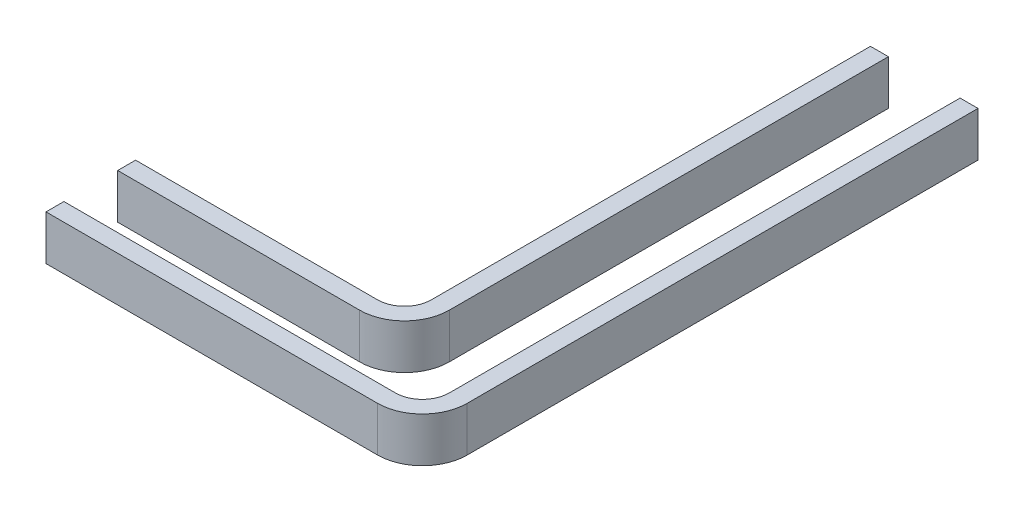
ISO-10303-21;
HEADER;
FILE_DESCRIPTION(('STEP AP214'),'2;1');
FILE_NAME('part.step','',(''),(''),'','','');
FILE_SCHEMA(('AUTOMOTIVE_DESIGN { 1 0 10303 214 1 1 1 1 }'));
ENDSEC;
DATA;
#1=APPLICATION_CONTEXT('core data for automotive mechanical design processes');
#2=APPLICATION_PROTOCOL_DEFINITION('international standard','automotive_design',2000,#1);
#3=PRODUCT_CONTEXT('',#1,'mechanical');
#4=PRODUCT('Part','Part','',(#3));
#5=PRODUCT_RELATED_PRODUCT_CATEGORY('part','',(#4));
#6=PRODUCT_DEFINITION_FORMATION('','',#4);
#7=PRODUCT_DEFINITION_CONTEXT('part definition',#1,'design');
#8=PRODUCT_DEFINITION('design','',#6,#7);
#9=PRODUCT_DEFINITION_SHAPE('','',#8);
#10=(LENGTH_UNIT() NAMED_UNIT(*) SI_UNIT(.MILLI.,.METRE.));
#11=(NAMED_UNIT(*) PLANE_ANGLE_UNIT() SI_UNIT($,.RADIAN.));
#12=(NAMED_UNIT(*) SI_UNIT($,.STERADIAN.) SOLID_ANGLE_UNIT());
#13=UNCERTAINTY_MEASURE_WITH_UNIT(LENGTH_MEASURE(1.E-05),#10,'distance_accuracy_value','');
#14=(GEOMETRIC_REPRESENTATION_CONTEXT(3) GLOBAL_UNCERTAINTY_ASSIGNED_CONTEXT((#13)) GLOBAL_UNIT_ASSIGNED_CONTEXT((#10,
#11,#12)) REPRESENTATION_CONTEXT('',''));
#15=CARTESIAN_POINT('',(0.,0.,0.));
#16=DIRECTION('',(0.,0.,1.));
#17=DIRECTION('',(1.,0.,0.));
#18=AXIS2_PLACEMENT_3D('',#15,#16,#17);
#19=CARTESIAN_POINT('',(0.,5.,0.));
#20=DIRECTION('',(0.,1.,0.));
#21=DIRECTION('',(0.,0.,1.));
#22=AXIS2_PLACEMENT_3D('',#19,#20,#21);
#23=PLANE('',#22);
#24=DIRECTION('',(1.,0.,0.));
#25=VECTOR('',#24,1.);
#26=CARTESIAN_POINT('',(0.,5.,-57.));
#27=LINE('',#26,#25);
#28=CARTESIAN_POINT('',(30.,5.,-57.));
#29=VERTEX_POINT('',#28);
#30=CARTESIAN_POINT('',(32.,5.,-57.));
#31=VERTEX_POINT('',#30);
#32=EDGE_CURVE('E169',#29,#31,#27,.T.);
#33=ORIENTED_EDGE('',*,*,#32,.F.);
#34=DIRECTION('',(0.,0.,1.));
#35=VECTOR('',#34,1.);
#36=CARTESIAN_POINT('',(30.,5.,0.));
#37=LINE('',#36,#35);
#38=CARTESIAN_POINT('',(30.,5.,-8.));
#39=VERTEX_POINT('',#38);
#40=EDGE_CURVE('E221',#29,#39,#37,.T.);
#41=ORIENTED_EDGE('',*,*,#40,.T.);
#42=CARTESIAN_POINT('',(27.,5.,-8.));
#43=DIRECTION('',(0.,1.,0.));
#44=DIRECTION('',(0.,0.,1.));
#45=AXIS2_PLACEMENT_3D('',#42,#43,#44);
#46=CIRCLE('',#45,3.);
#47=CARTESIAN_POINT('',(27.,5.,-5.));
#48=VERTEX_POINT('',#47);
#49=EDGE_CURVE('E223',#39,#48,#46,.F.);
#50=ORIENTED_EDGE('',*,*,#49,.T.);
#51=DIRECTION('',(1.,0.,0.));
#52=VECTOR('',#51,1.);
#53=CARTESIAN_POINT('',(0.,5.,-5.));
#54=LINE('',#53,#52);
#55=CARTESIAN_POINT('',(0.,5.,-5.));
#56=VERTEX_POINT('',#55);
#57=EDGE_CURVE('E225',#56,#48,#54,.T.);
#58=ORIENTED_EDGE('',*,*,#57,.F.);
#59=DIRECTION('',(0.,0.,-1.));
#60=VECTOR('',#59,1.);
#61=CARTESIAN_POINT('',(0.,5.,0.));
#62=LINE('',#61,#60);
#63=CARTESIAN_POINT('',(0.,5.,-3.));
#64=VERTEX_POINT('',#63);
#65=EDGE_CURVE('E235',#64,#56,#62,.T.);
#66=ORIENTED_EDGE('',*,*,#65,.F.);
#67=DIRECTION('',(1.,0.,0.));
#68=VECTOR('',#67,1.);
#69=CARTESIAN_POINT('',(0.,5.,-3.));
#70=LINE('',#69,#68);
#71=CARTESIAN_POINT('',(27.,5.,-3.));
#72=VERTEX_POINT('',#71);
#73=EDGE_CURVE('E227',#64,#72,#70,.T.);
#74=ORIENTED_EDGE('',*,*,#73,.T.);
#75=CARTESIAN_POINT('',(27.,5.,-8.));
#76=DIRECTION('',(0.,1.,0.));
#77=DIRECTION('',(0.,0.,1.));
#78=AXIS2_PLACEMENT_3D('',#75,#76,#77);
#79=CIRCLE('',#78,5.);
#80=CARTESIAN_POINT('',(32.,5.,-8.));
#81=VERTEX_POINT('',#80);
#82=EDGE_CURVE('E241',#72,#81,#79,.T.);
#83=ORIENTED_EDGE('',*,*,#82,.T.);
#84=DIRECTION('',(0.,0.,1.));
#85=VECTOR('',#84,1.);
#86=CARTESIAN_POINT('',(32.,5.,0.));
#87=LINE('',#86,#85);
#88=EDGE_CURVE('E254',#31,#81,#87,.T.);
#89=ORIENTED_EDGE('',*,*,#88,.F.);
#90=EDGE_LOOP('',(#33,#41,#50,#58,#66,#74,#83,#89));
#91=FACE_BOUND('',#90,.T.);
#92=ADVANCED_FACE('F143',(#91),#23,.T.);
#93=CARTESIAN_POINT('',(0.,0.,0.));
#94=DIRECTION('',(0.,1.,0.));
#95=DIRECTION('',(0.,0.,1.));
#96=AXIS2_PLACEMENT_3D('',#93,#94,#95);
#97=PLANE('',#96);
#98=DIRECTION('',(0.,0.,1.));
#99=VECTOR('',#98,1.);
#100=CARTESIAN_POINT('',(30.,0.,0.));
#101=LINE('',#100,#99);
#102=CARTESIAN_POINT('',(30.,0.,-57.));
#103=VERTEX_POINT('',#102);
#104=CARTESIAN_POINT('',(30.,0.,-8.));
#105=VERTEX_POINT('',#104);
#106=EDGE_CURVE('E214',#103,#105,#101,.T.);
#107=ORIENTED_EDGE('',*,*,#106,.F.);
#108=DIRECTION('',(1.,0.,0.));
#109=VECTOR('',#108,1.);
#110=CARTESIAN_POINT('',(30.,0.,-57.));
#111=LINE('',#110,#109);
#112=CARTESIAN_POINT('',(32.,0.,-57.));
#113=VERTEX_POINT('',#112);
#114=EDGE_CURVE('E147',#103,#113,#111,.T.);
#115=ORIENTED_EDGE('',*,*,#114,.T.);
#116=DIRECTION('',(0.,0.,1.));
#117=VECTOR('',#116,1.);
#118=CARTESIAN_POINT('',(32.,0.,0.));
#119=LINE('',#118,#117);
#120=CARTESIAN_POINT('',(32.,0.,-8.));
#121=VERTEX_POINT('',#120);
#122=EDGE_CURVE('E250',#113,#121,#119,.T.);
#123=ORIENTED_EDGE('',*,*,#122,.T.);
#124=CARTESIAN_POINT('',(27.,0.,-8.));
#125=DIRECTION('',(0.,1.,0.));
#126=DIRECTION('',(0.,0.,1.));
#127=AXIS2_PLACEMENT_3D('',#124,#125,#126);
#128=CIRCLE('',#127,5.);
#129=CARTESIAN_POINT('',(27.,0.,-3.));
#130=VERTEX_POINT('',#129);
#131=EDGE_CURVE('E247',#121,#130,#128,.F.);
#132=ORIENTED_EDGE('',*,*,#131,.T.);
#133=DIRECTION('',(1.,0.,0.));
#134=VECTOR('',#133,1.);
#135=CARTESIAN_POINT('',(0.,0.,-3.));
#136=LINE('',#135,#134);
#137=CARTESIAN_POINT('',(0.,0.,-3.));
#138=VERTEX_POINT('',#137);
#139=EDGE_CURVE('E246',#138,#130,#136,.T.);
#140=ORIENTED_EDGE('',*,*,#139,.F.);
#141=DIRECTION('',(0.,0.,-1.));
#142=VECTOR('',#141,1.);
#143=CARTESIAN_POINT('',(0.,0.,0.));
#144=LINE('',#143,#142);
#145=CARTESIAN_POINT('',(0.,0.,-5.));
#146=VERTEX_POINT('',#145);
#147=EDGE_CURVE('E249',#138,#146,#144,.T.);
#148=ORIENTED_EDGE('',*,*,#147,.T.);
#149=DIRECTION('',(1.,0.,0.));
#150=VECTOR('',#149,1.);
#151=CARTESIAN_POINT('',(0.,0.,-5.));
#152=LINE('',#151,#150);
#153=CARTESIAN_POINT('',(27.,0.,-5.));
#154=VERTEX_POINT('',#153);
#155=EDGE_CURVE('E260',#146,#154,#152,.T.);
#156=ORIENTED_EDGE('',*,*,#155,.T.);
#157=CARTESIAN_POINT('',(27.,0.,-8.));
#158=DIRECTION('',(0.,1.,0.));
#159=DIRECTION('',(0.,0.,1.));
#160=AXIS2_PLACEMENT_3D('',#157,#158,#159);
#161=CIRCLE('',#160,3.);
#162=EDGE_CURVE('E177',#154,#105,#161,.T.);
#163=ORIENTED_EDGE('',*,*,#162,.T.);
#164=EDGE_LOOP('',(#107,#115,#123,#132,#140,#148,#156,#163));
#165=FACE_BOUND('',#164,.T.);
#166=ADVANCED_FACE('F283',(#165),#97,.F.);
#167=CARTESIAN_POINT('',(30.,5.,0.));
#168=DIRECTION('',(1.,0.,0.));
#169=DIRECTION('',(0.,0.,-1.));
#170=AXIS2_PLACEMENT_3D('',#167,#168,#169);
#171=PLANE('',#170);
#172=ORIENTED_EDGE('',*,*,#40,.F.);
#173=DIRECTION('',(0.,1.,0.));
#174=VECTOR('',#173,1.);
#175=CARTESIAN_POINT('',(30.,0.,-57.));
#176=LINE('',#175,#174);
#177=EDGE_CURVE('E13',#103,#29,#176,.T.);
#178=ORIENTED_EDGE('',*,*,#177,.F.);
#179=ORIENTED_EDGE('',*,*,#106,.T.);
#180=DIRECTION('',(0.,-1.,0.));
#181=VECTOR('',#180,1.);
#182=CARTESIAN_POINT('',(30.,5.,-8.));
#183=LINE('',#182,#181);
#184=EDGE_CURVE('E232',#105,#39,#183,.F.);
#185=ORIENTED_EDGE('',*,*,#184,.T.);
#186=EDGE_LOOP('',(#172,#178,#179,#185));
#187=FACE_BOUND('',#186,.T.);
#188=ADVANCED_FACE('F285',(#187),#171,.F.);
#189=CARTESIAN_POINT('',(0.,5.,-5.));
#190=DIRECTION('',(0.,0.,-1.));
#191=DIRECTION('',(-1.,0.,0.));
#192=AXIS2_PLACEMENT_3D('',#189,#190,#191);
#193=PLANE('',#192);
#194=ORIENTED_EDGE('',*,*,#57,.T.);
#195=DIRECTION('',(0.,-1.,0.));
#196=VECTOR('',#195,1.);
#197=CARTESIAN_POINT('',(27.,5.,-5.));
#198=LINE('',#197,#196);
#199=EDGE_CURVE('E230',#48,#154,#198,.T.);
#200=ORIENTED_EDGE('',*,*,#199,.T.);
#201=ORIENTED_EDGE('',*,*,#155,.F.);
#202=DIRECTION('',(0.,-1.,0.));
#203=VECTOR('',#202,1.);
#204=CARTESIAN_POINT('',(0.,5.,-5.));
#205=LINE('',#204,#203);
#206=EDGE_CURVE('E208',#56,#146,#205,.T.);
#207=ORIENTED_EDGE('',*,*,#206,.F.);
#208=EDGE_LOOP('',(#194,#200,#201,#207));
#209=FACE_BOUND('',#208,.T.);
#210=ADVANCED_FACE('F229',(#209),#193,.T.);
#211=CARTESIAN_POINT('',(0.,5.,0.));
#212=DIRECTION('',(-1.,0.,0.));
#213=DIRECTION('',(0.,0.,1.));
#214=AXIS2_PLACEMENT_3D('',#211,#212,#213);
#215=PLANE('',#214);
#216=ORIENTED_EDGE('',*,*,#147,.F.);
#217=DIRECTION('',(0.,-1.,0.));
#218=VECTOR('',#217,1.);
#219=CARTESIAN_POINT('',(0.,5.,-3.));
#220=LINE('',#219,#218);
#221=EDGE_CURVE('E245',#64,#138,#220,.T.);
#222=ORIENTED_EDGE('',*,*,#221,.F.);
#223=ORIENTED_EDGE('',*,*,#65,.T.);
#224=ORIENTED_EDGE('',*,*,#206,.T.);
#225=EDGE_LOOP('',(#216,#222,#223,#224));
#226=FACE_BOUND('',#225,.T.);
#227=ADVANCED_FACE('F292',(#226),#215,.T.);
#228=CARTESIAN_POINT('',(0.,5.,-3.));
#229=DIRECTION('',(0.,0.,-1.));
#230=DIRECTION('',(-1.,0.,0.));
#231=AXIS2_PLACEMENT_3D('',#228,#229,#230);
#232=PLANE('',#231);
#233=ORIENTED_EDGE('',*,*,#139,.T.);
#234=DIRECTION('',(0.,-1.,0.));
#235=VECTOR('',#234,1.);
#236=CARTESIAN_POINT('',(27.,5.,-3.));
#237=LINE('',#236,#235);
#238=EDGE_CURVE('E243',#130,#72,#237,.F.);
#239=ORIENTED_EDGE('',*,*,#238,.T.);
#240=ORIENTED_EDGE('',*,*,#73,.F.);
#241=ORIENTED_EDGE('',*,*,#221,.T.);
#242=EDGE_LOOP('',(#233,#239,#240,#241));
#243=FACE_BOUND('',#242,.T.);
#244=ADVANCED_FACE('F294',(#243),#232,.F.);
#245=CARTESIAN_POINT('',(32.,5.,0.));
#246=DIRECTION('',(1.,0.,0.));
#247=DIRECTION('',(0.,0.,-1.));
#248=AXIS2_PLACEMENT_3D('',#245,#246,#247);
#249=PLANE('',#248);
#250=ORIENTED_EDGE('',*,*,#88,.T.);
#251=DIRECTION('',(0.,-1.,0.));
#252=VECTOR('',#251,1.);
#253=CARTESIAN_POINT('',(32.,0.,-8.));
#254=LINE('',#253,#252);
#255=EDGE_CURVE('E251',#81,#121,#254,.T.);
#256=ORIENTED_EDGE('',*,*,#255,.T.);
#257=ORIENTED_EDGE('',*,*,#122,.F.);
#258=DIRECTION('',(0.,-1.,0.));
#259=VECTOR('',#258,1.);
#260=CARTESIAN_POINT('',(32.,5.,-57.));
#261=LINE('',#260,#259);
#262=EDGE_CURVE('E153',#31,#113,#261,.T.);
#263=ORIENTED_EDGE('',*,*,#262,.F.);
#264=EDGE_LOOP('',(#250,#256,#257,#263));
#265=FACE_BOUND('',#264,.T.);
#266=ADVANCED_FACE('F281',(#265),#249,.T.);
#267=CARTESIAN_POINT('',(27.,5.,-8.));
#268=DIRECTION('',(0.,1.,0.));
#269=DIRECTION('',(0.,0.,1.));
#270=AXIS2_PLACEMENT_3D('',#267,#268,#269);
#271=CYLINDRICAL_SURFACE('',#270,5.);
#272=ORIENTED_EDGE('',*,*,#82,.F.);
#273=ORIENTED_EDGE('',*,*,#238,.F.);
#274=ORIENTED_EDGE('',*,*,#131,.F.);
#275=ORIENTED_EDGE('',*,*,#255,.F.);
#276=EDGE_LOOP('',(#272,#273,#274,#275));
#277=FACE_BOUND('',#276,.T.);
#278=ADVANCED_FACE('F278',(#277),#271,.T.);
#279=CARTESIAN_POINT('',(27.,5.,-8.));
#280=DIRECTION('',(0.,-1.,0.));
#281=DIRECTION('',(0.,0.,-1.));
#282=AXIS2_PLACEMENT_3D('',#279,#280,#281);
#283=CYLINDRICAL_SURFACE('',#282,3.);
#284=ORIENTED_EDGE('',*,*,#49,.F.);
#285=ORIENTED_EDGE('',*,*,#184,.F.);
#286=ORIENTED_EDGE('',*,*,#162,.F.);
#287=ORIENTED_EDGE('',*,*,#199,.F.);
#288=EDGE_LOOP('',(#284,#285,#286,#287));
#289=FACE_BOUND('',#288,.T.);
#290=ADVANCED_FACE('F234',(#289),#283,.F.);
#291=CARTESIAN_POINT('',(30.,0.,-57.));
#292=DIRECTION('',(0.,0.,1.));
#293=DIRECTION('',(1.,0.,0.));
#294=AXIS2_PLACEMENT_3D('',#291,#292,#293);
#295=PLANE('',#294);
#296=ORIENTED_EDGE('',*,*,#32,.T.);
#297=ORIENTED_EDGE('',*,*,#262,.T.);
#298=ORIENTED_EDGE('',*,*,#114,.F.);
#299=ORIENTED_EDGE('',*,*,#177,.T.);
#300=EDGE_LOOP('',(#296,#297,#298,#299));
#301=FACE_BOUND('',#300,.T.);
#302=ADVANCED_FACE('F145',(#301),#295,.F.);
#303=CLOSED_SHELL('',(#92,#166,#188,#210,#227,#244,#266,#278,#290,#302));
#304=MANIFOLD_SOLID_BREP('B2',#303);
#305=CARTESIAN_POINT('',(37.,5.,0.));
#306=DIRECTION('',(0.,-1.,0.));
#307=DIRECTION('',(0.,0.,-1.));
#308=AXIS2_PLACEMENT_3D('',#305,#306,#307);
#309=CYLINDRICAL_SURFACE('',#308,3.);
#310=CARTESIAN_POINT('',(37.,5.,0.));
#311=DIRECTION('',(0.,1.,0.));
#312=DIRECTION('',(0.,0.,1.));
#313=AXIS2_PLACEMENT_3D('',#310,#311,#312);
#314=CIRCLE('',#313,3.);
#315=CARTESIAN_POINT('',(40.,5.,0.));
#316=VERTEX_POINT('',#315);
#317=CARTESIAN_POINT('',(37.,5.,3.));
#318=VERTEX_POINT('',#317);
#319=EDGE_CURVE('E141',#316,#318,#314,.F.);
#320=ORIENTED_EDGE('',*,*,#319,.F.);
#321=DIRECTION('',(0.,-1.,0.));
#322=VECTOR('',#321,1.);
#323=CARTESIAN_POINT('',(40.,5.,0.));
#324=LINE('',#323,#322);
#325=CARTESIAN_POINT('',(40.,0.,0.));
#326=VERTEX_POINT('',#325);
#327=EDGE_CURVE('E408',#326,#316,#324,.F.);
#328=ORIENTED_EDGE('',*,*,#327,.F.);
#329=CARTESIAN_POINT('',(37.,0.,0.));
#330=DIRECTION('',(0.,1.,0.));
#331=DIRECTION('',(0.,0.,1.));
#332=AXIS2_PLACEMENT_3D('',#329,#330,#331);
#333=CIRCLE('',#332,3.);
#334=CARTESIAN_POINT('',(37.,0.,3.));
#335=VERTEX_POINT('',#334);
#336=EDGE_CURVE('E393',#335,#326,#333,.T.);
#337=ORIENTED_EDGE('',*,*,#336,.F.);
#338=DIRECTION('',(0.,-1.,0.));
#339=VECTOR('',#338,1.);
#340=CARTESIAN_POINT('',(37.,5.,3.));
#341=LINE('',#340,#339);
#342=EDGE_CURVE('E490',#318,#335,#341,.T.);
#343=ORIENTED_EDGE('',*,*,#342,.F.);
#344=EDGE_LOOP('',(#320,#328,#337,#343));
#345=FACE_BOUND('',#344,.T.);
#346=ADVANCED_FACE('F386',(#345),#309,.F.);
#347=CARTESIAN_POINT('',(0.,5.,3.));
#348=DIRECTION('',(0.,0.,-1.));
#349=DIRECTION('',(-1.,0.,0.));
#350=AXIS2_PLACEMENT_3D('',#347,#348,#349);
#351=PLANE('',#350);
#352=DIRECTION('',(1.,0.,0.));
#353=VECTOR('',#352,1.);
#354=CARTESIAN_POINT('',(0.,5.,3.));
#355=LINE('',#354,#353);
#356=CARTESIAN_POINT('',(0.,5.,3.));
#357=VERTEX_POINT('',#356);
#358=EDGE_CURVE('E499',#357,#318,#355,.T.);
#359=ORIENTED_EDGE('',*,*,#358,.T.);
#360=ORIENTED_EDGE('',*,*,#342,.T.);
#361=DIRECTION('',(1.,0.,0.));
#362=VECTOR('',#361,1.);
#363=CARTESIAN_POINT('',(0.,0.,3.));
#364=LINE('',#363,#362);
#365=CARTESIAN_POINT('',(0.,0.,3.));
#366=VERTEX_POINT('',#365);
#367=EDGE_CURVE('E466',#366,#335,#364,.T.);
#368=ORIENTED_EDGE('',*,*,#367,.F.);
#369=DIRECTION('',(0.,-1.,0.));
#370=VECTOR('',#369,1.);
#371=CARTESIAN_POINT('',(0.,5.,3.));
#372=LINE('',#371,#370);
#373=EDGE_CURVE('E462',#357,#366,#372,.T.);
#374=ORIENTED_EDGE('',*,*,#373,.F.);
#375=EDGE_LOOP('',(#359,#360,#368,#374));
#376=FACE_BOUND('',#375,.T.);
#377=ADVANCED_FACE('F497',(#376),#351,.T.);
#378=CARTESIAN_POINT('',(0.,5.,0.));
#379=DIRECTION('',(-1.,0.,0.));
#380=DIRECTION('',(0.,0.,1.));
#381=AXIS2_PLACEMENT_3D('',#378,#379,#380);
#382=PLANE('',#381);
#383=DIRECTION('',(0.,0.,-1.));
#384=VECTOR('',#383,1.);
#385=CARTESIAN_POINT('',(0.,0.,0.));
#386=LINE('',#385,#384);
#387=CARTESIAN_POINT('',(0.,0.,5.));
#388=VERTEX_POINT('',#387);
#389=EDGE_CURVE('E469',#388,#366,#386,.T.);
#390=ORIENTED_EDGE('',*,*,#389,.F.);
#391=DIRECTION('',(0.,-1.,0.));
#392=VECTOR('',#391,1.);
#393=CARTESIAN_POINT('',(0.,5.,5.));
#394=LINE('',#393,#392);
#395=CARTESIAN_POINT('',(0.,5.,5.));
#396=VERTEX_POINT('',#395);
#397=EDGE_CURVE('E478',#396,#388,#394,.T.);
#398=ORIENTED_EDGE('',*,*,#397,.F.);
#399=DIRECTION('',(0.,0.,-1.));
#400=VECTOR('',#399,1.);
#401=CARTESIAN_POINT('',(0.,5.,0.));
#402=LINE('',#401,#400);
#403=EDGE_CURVE('E480',#396,#357,#402,.T.);
#404=ORIENTED_EDGE('',*,*,#403,.T.);
#405=ORIENTED_EDGE('',*,*,#373,.T.);
#406=EDGE_LOOP('',(#390,#398,#404,#405));
#407=FACE_BOUND('',#406,.T.);
#408=ADVANCED_FACE('F506',(#407),#382,.T.);
#409=CARTESIAN_POINT('',(0.,5.,5.));
#410=DIRECTION('',(0.,0.,-1.));
#411=DIRECTION('',(-1.,0.,0.));
#412=AXIS2_PLACEMENT_3D('',#409,#410,#411);
#413=PLANE('',#412);
#414=DIRECTION('',(1.,0.,0.));
#415=VECTOR('',#414,1.);
#416=CARTESIAN_POINT('',(0.,0.,5.));
#417=LINE('',#416,#415);
#418=CARTESIAN_POINT('',(37.,0.,5.));
#419=VERTEX_POINT('',#418);
#420=EDGE_CURVE('E471',#388,#419,#417,.T.);
#421=ORIENTED_EDGE('',*,*,#420,.T.);
#422=DIRECTION('',(0.,-1.,0.));
#423=VECTOR('',#422,1.);
#424=CARTESIAN_POINT('',(37.,5.,5.));
#425=LINE('',#424,#423);
#426=CARTESIAN_POINT('',(37.,5.,5.));
#427=VERTEX_POINT('',#426);
#428=EDGE_CURVE('E488',#419,#427,#425,.F.);
#429=ORIENTED_EDGE('',*,*,#428,.T.);
#430=DIRECTION('',(1.,0.,0.));
#431=VECTOR('',#430,1.);
#432=CARTESIAN_POINT('',(0.,5.,5.));
#433=LINE('',#432,#431);
#434=EDGE_CURVE('E477',#396,#427,#433,.T.);
#435=ORIENTED_EDGE('',*,*,#434,.F.);
#436=ORIENTED_EDGE('',*,*,#397,.T.);
#437=EDGE_LOOP('',(#421,#429,#435,#436));
#438=FACE_BOUND('',#437,.T.);
#439=ADVANCED_FACE('F532',(#438),#413,.F.);
#440=CARTESIAN_POINT('',(37.,5.,0.));
#441=DIRECTION('',(0.,-1.,0.));
#442=DIRECTION('',(0.,0.,-1.));
#443=AXIS2_PLACEMENT_3D('',#440,#441,#442);
#444=CYLINDRICAL_SURFACE('',#443,5.);
#445=CARTESIAN_POINT('',(37.,5.,0.));
#446=DIRECTION('',(0.,1.,0.));
#447=DIRECTION('',(0.,0.,1.));
#448=AXIS2_PLACEMENT_3D('',#445,#446,#447);
#449=CIRCLE('',#448,5.);
#450=CARTESIAN_POINT('',(42.,5.,0.));
#451=VERTEX_POINT('',#450);
#452=EDGE_CURVE('E483',#427,#451,#449,.T.);
#453=ORIENTED_EDGE('',*,*,#452,.F.);
#454=ORIENTED_EDGE('',*,*,#428,.F.);
#455=CARTESIAN_POINT('',(37.,0.,0.));
#456=DIRECTION('',(0.,1.,0.));
#457=DIRECTION('',(0.,0.,1.));
#458=AXIS2_PLACEMENT_3D('',#455,#456,#457);
#459=CIRCLE('',#458,5.);
#460=CARTESIAN_POINT('',(42.,0.,0.));
#461=VERTEX_POINT('',#460);
#462=EDGE_CURVE('E461',#461,#419,#459,.F.);
#463=ORIENTED_EDGE('',*,*,#462,.F.);
#464=DIRECTION('',(0.,-1.,0.));
#465=VECTOR('',#464,1.);
#466=CARTESIAN_POINT('',(42.,5.,0.));
#467=LINE('',#466,#465);
#468=EDGE_CURVE('E485',#451,#461,#467,.T.);
#469=ORIENTED_EDGE('',*,*,#468,.F.);
#470=EDGE_LOOP('',(#453,#454,#463,#469));
#471=FACE_BOUND('',#470,.T.);
#472=ADVANCED_FACE('F531',(#471),#444,.T.);
#473=CARTESIAN_POINT('',(0.,5.,0.));
#474=DIRECTION('',(0.,1.,0.));
#475=DIRECTION('',(0.,0.,1.));
#476=AXIS2_PLACEMENT_3D('',#473,#474,#475);
#477=PLANE('',#476);
#478=DIRECTION('',(1.,0.,0.));
#479=VECTOR('',#478,1.);
#480=CARTESIAN_POINT('',(0.,5.,-57.));
#481=LINE('',#480,#479);
#482=CARTESIAN_POINT('',(40.,5.,-57.));
#483=VERTEX_POINT('',#482);
#484=CARTESIAN_POINT('',(42.,5.,-57.));
#485=VERTEX_POINT('',#484);
#486=EDGE_CURVE('E518',#483,#485,#481,.T.);
#487=ORIENTED_EDGE('',*,*,#486,.F.);
#488=DIRECTION('',(0.,0.,1.));
#489=VECTOR('',#488,1.);
#490=CARTESIAN_POINT('',(40.,5.,0.));
#491=LINE('',#490,#489);
#492=EDGE_CURVE('E460',#483,#316,#491,.T.);
#493=ORIENTED_EDGE('',*,*,#492,.T.);
#494=ORIENTED_EDGE('',*,*,#319,.T.);
#495=ORIENTED_EDGE('',*,*,#358,.F.);
#496=ORIENTED_EDGE('',*,*,#403,.F.);
#497=ORIENTED_EDGE('',*,*,#434,.T.);
#498=ORIENTED_EDGE('',*,*,#452,.T.);
#499=DIRECTION('',(0.,0.,-1.));
#500=VECTOR('',#499,1.);
#501=CARTESIAN_POINT('',(42.,5.,0.));
#502=LINE('',#501,#500);
#503=EDGE_CURVE('E515',#451,#485,#502,.T.);
#504=ORIENTED_EDGE('',*,*,#503,.T.);
#505=EDGE_LOOP('',(#487,#493,#494,#495,#496,#497,#498,#504));
#506=FACE_BOUND('',#505,.T.);
#507=ADVANCED_FACE('F511',(#506),#477,.T.);
#508=CARTESIAN_POINT('',(0.,0.,0.));
#509=DIRECTION('',(0.,1.,0.));
#510=DIRECTION('',(0.,0.,1.));
#511=AXIS2_PLACEMENT_3D('',#508,#509,#510);
#512=PLANE('',#511);
#513=DIRECTION('',(0.,0.,1.));
#514=VECTOR('',#513,1.);
#515=CARTESIAN_POINT('',(40.,0.,0.));
#516=LINE('',#515,#514);
#517=CARTESIAN_POINT('',(40.,0.,-57.));
#518=VERTEX_POINT('',#517);
#519=EDGE_CURVE('E459',#518,#326,#516,.T.);
#520=ORIENTED_EDGE('',*,*,#519,.F.);
#521=DIRECTION('',(1.,0.,0.));
#522=VECTOR('',#521,1.);
#523=CARTESIAN_POINT('',(30.,0.,-57.));
#524=LINE('',#523,#522);
#525=CARTESIAN_POINT('',(42.,0.,-57.));
#526=VERTEX_POINT('',#525);
#527=EDGE_CURVE('E448',#518,#526,#524,.T.);
#528=ORIENTED_EDGE('',*,*,#527,.T.);
#529=DIRECTION('',(0.,0.,-1.));
#530=VECTOR('',#529,1.);
#531=CARTESIAN_POINT('',(42.,0.,0.));
#532=LINE('',#531,#530);
#533=EDGE_CURVE('E467',#461,#526,#532,.T.);
#534=ORIENTED_EDGE('',*,*,#533,.F.);
#535=ORIENTED_EDGE('',*,*,#462,.T.);
#536=ORIENTED_EDGE('',*,*,#420,.F.);
#537=ORIENTED_EDGE('',*,*,#389,.T.);
#538=ORIENTED_EDGE('',*,*,#367,.T.);
#539=ORIENTED_EDGE('',*,*,#336,.T.);
#540=EDGE_LOOP('',(#520,#528,#534,#535,#536,#537,#538,#539));
#541=FACE_BOUND('',#540,.T.);
#542=ADVANCED_FACE('F464',(#541),#512,.F.);
#543=CARTESIAN_POINT('',(40.,5.,0.));
#544=DIRECTION('',(1.,0.,0.));
#545=DIRECTION('',(0.,0.,-1.));
#546=AXIS2_PLACEMENT_3D('',#543,#544,#545);
#547=PLANE('',#546);
#548=ORIENTED_EDGE('',*,*,#519,.T.);
#549=ORIENTED_EDGE('',*,*,#327,.T.);
#550=ORIENTED_EDGE('',*,*,#492,.F.);
#551=DIRECTION('',(0.,-1.,0.));
#552=VECTOR('',#551,1.);
#553=CARTESIAN_POINT('',(40.,5.,-57.));
#554=LINE('',#553,#552);
#555=EDGE_CURVE('E451',#483,#518,#554,.T.);
#556=ORIENTED_EDGE('',*,*,#555,.T.);
#557=EDGE_LOOP('',(#548,#549,#550,#556));
#558=FACE_BOUND('',#557,.T.);
#559=ADVANCED_FACE('F458',(#558),#547,.F.);
#560=CARTESIAN_POINT('',(42.,5.,0.));
#561=DIRECTION('',(-1.,0.,0.));
#562=DIRECTION('',(0.,0.,1.));
#563=AXIS2_PLACEMENT_3D('',#560,#561,#562);
#564=PLANE('',#563);
#565=ORIENTED_EDGE('',*,*,#533,.T.);
#566=DIRECTION('',(0.,1.,0.));
#567=VECTOR('',#566,1.);
#568=CARTESIAN_POINT('',(42.,0.,-57.));
#569=LINE('',#568,#567);
#570=EDGE_CURVE('E400',#526,#485,#569,.T.);
#571=ORIENTED_EDGE('',*,*,#570,.T.);
#572=ORIENTED_EDGE('',*,*,#503,.F.);
#573=ORIENTED_EDGE('',*,*,#468,.T.);
#574=EDGE_LOOP('',(#565,#571,#572,#573));
#575=FACE_BOUND('',#574,.T.);
#576=ADVANCED_FACE('F529',(#575),#564,.F.);
#577=CARTESIAN_POINT('',(30.,0.,-57.));
#578=DIRECTION('',(0.,0.,1.));
#579=DIRECTION('',(1.,0.,0.));
#580=AXIS2_PLACEMENT_3D('',#577,#578,#579);
#581=PLANE('',#580);
#582=ORIENTED_EDGE('',*,*,#486,.T.);
#583=ORIENTED_EDGE('',*,*,#570,.F.);
#584=ORIENTED_EDGE('',*,*,#527,.F.);
#585=ORIENTED_EDGE('',*,*,#555,.F.);
#586=EDGE_LOOP('',(#582,#583,#584,#585));
#587=FACE_BOUND('',#586,.T.);
#588=ADVANCED_FACE('F450',(#587),#581,.F.);
#589=CLOSED_SHELL('',(#346,#377,#408,#439,#472,#507,#542,#559,#576,#588));
#590=MANIFOLD_SOLID_BREP('B7',#589);
#591=ADVANCED_BREP_SHAPE_REPRESENTATION('',(#18,#304,#590),#14);
#592=SHAPE_DEFINITION_REPRESENTATION(#9,#591);
ENDSEC;
END-ISO-10303-21;
